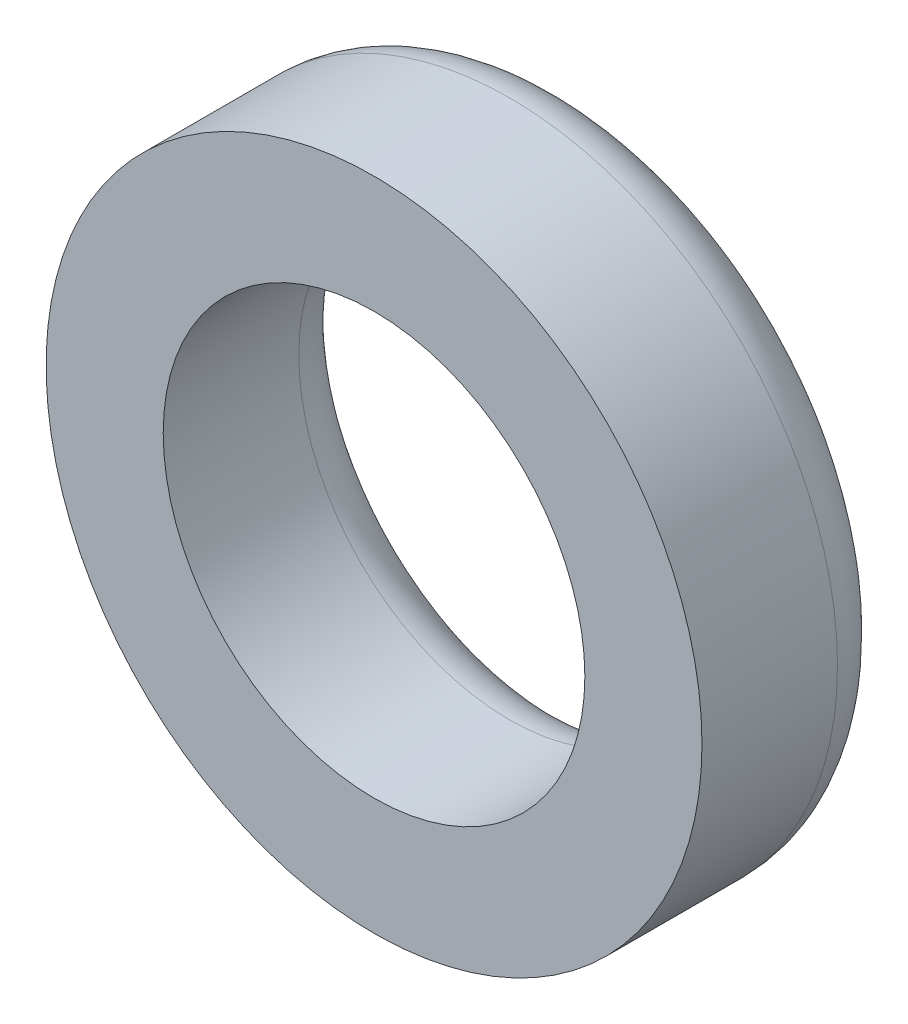
ISO-10303-21;
HEADER;
FILE_DESCRIPTION(('STEP AP214'),'2;1');
FILE_NAME('part.step','',(''),(''),'','','');
FILE_SCHEMA(('AUTOMOTIVE_DESIGN { 1 0 10303 214 1 1 1 1 }'));
ENDSEC;
DATA;
#1=APPLICATION_CONTEXT('core data for automotive mechanical design processes');
#2=APPLICATION_PROTOCOL_DEFINITION('international standard','automotive_design',2000,#1);
#3=PRODUCT_CONTEXT('',#1,'mechanical');
#4=PRODUCT('Part','Part','',(#3));
#5=PRODUCT_RELATED_PRODUCT_CATEGORY('part','',(#4));
#6=PRODUCT_DEFINITION_FORMATION('','',#4);
#7=PRODUCT_DEFINITION_CONTEXT('part definition',#1,'design');
#8=PRODUCT_DEFINITION('design','',#6,#7);
#9=PRODUCT_DEFINITION_SHAPE('','',#8);
#10=(LENGTH_UNIT() NAMED_UNIT(*) SI_UNIT(.MILLI.,.METRE.));
#11=(NAMED_UNIT(*) PLANE_ANGLE_UNIT() SI_UNIT($,.RADIAN.));
#12=(NAMED_UNIT(*) SI_UNIT($,.STERADIAN.) SOLID_ANGLE_UNIT());
#13=UNCERTAINTY_MEASURE_WITH_UNIT(LENGTH_MEASURE(1.E-05),#10,'distance_accuracy_value','');
#14=(GEOMETRIC_REPRESENTATION_CONTEXT(3) GLOBAL_UNCERTAINTY_ASSIGNED_CONTEXT((#13)) GLOBAL_UNIT_ASSIGNED_CONTEXT((#10,
#11,#12)) REPRESENTATION_CONTEXT('',''));
#15=CARTESIAN_POINT('',(0.,0.,0.));
#16=DIRECTION('',(0.,0.,1.));
#17=DIRECTION('',(1.,0.,0.));
#18=AXIS2_PLACEMENT_3D('',#15,#16,#17);
#19=CARTESIAN_POINT('',(0.,0.,-4.05));
#20=DIRECTION('',(0.,0.,1.));
#21=DIRECTION('',(1.,0.,0.));
#22=AXIS2_PLACEMENT_3D('',#19,#20,#21);
#23=TOROIDAL_SURFACE('',#22,8.05,1.75);
#24=CARTESIAN_POINT('',(0.,0.,-4.05));
#25=DIRECTION('',(0.,0.,1.));
#26=DIRECTION('',(1.,0.,0.));
#27=AXIS2_PLACEMENT_3D('',#24,#25,#26);
#28=CIRCLE('',#27,6.3);
#29=CARTESIAN_POINT('',(6.3,0.,-4.05));
#30=VERTEX_POINT('',#29);
#31=EDGE_CURVE('E41',#30,#30,#28,.F.);
#32=ORIENTED_EDGE('',*,*,#31,.F.);
#33=EDGE_LOOP('',(#32));
#34=FACE_BOUND('',#33,.T.);
#35=CARTESIAN_POINT('',(0.,0.,-4.05));
#36=DIRECTION('',(0.,0.,1.));
#37=DIRECTION('',(1.,0.,0.));
#38=AXIS2_PLACEMENT_3D('',#35,#36,#37);
#39=CIRCLE('',#38,9.8);
#40=CARTESIAN_POINT('',(9.8,0.,-4.05));
#41=VERTEX_POINT('',#40);
#42=EDGE_CURVE('E10',#41,#41,#39,.T.);
#43=ORIENTED_EDGE('',*,*,#42,.F.);
#44=EDGE_LOOP('',(#43));
#45=FACE_BOUND('',#44,.T.);
#46=ADVANCED_FACE('F34',(#34,#45),#23,.T.);
#47=CARTESIAN_POINT('',(0.,0.,0.));
#48=DIRECTION('',(0.,0.,1.));
#49=DIRECTION('',(1.,0.,0.));
#50=AXIS2_PLACEMENT_3D('',#47,#48,#49);
#51=CYLINDRICAL_SURFACE('',#50,6.3);
#52=ORIENTED_EDGE('',*,*,#31,.T.);
#53=EDGE_LOOP('',(#52));
#54=FACE_BOUND('',#53,.T.);
#55=CARTESIAN_POINT('',(0.,0.,0.));
#56=DIRECTION('',(0.,0.,1.));
#57=DIRECTION('',(1.,0.,0.));
#58=AXIS2_PLACEMENT_3D('',#55,#56,#57);
#59=CIRCLE('',#58,6.3);
#60=CARTESIAN_POINT('',(6.3,0.,0.));
#61=VERTEX_POINT('',#60);
#62=EDGE_CURVE('E49',#61,#61,#59,.T.);
#63=ORIENTED_EDGE('',*,*,#62,.T.);
#64=EDGE_LOOP('',(#63));
#65=FACE_BOUND('',#64,.T.);
#66=ADVANCED_FACE('F55',(#54,#65),#51,.F.);
#67=CARTESIAN_POINT('',(0.,0.,0.));
#68=DIRECTION('',(0.,0.,1.));
#69=DIRECTION('',(1.,0.,0.));
#70=AXIS2_PLACEMENT_3D('',#67,#68,#69);
#71=CYLINDRICAL_SURFACE('',#70,9.8);
#72=ORIENTED_EDGE('',*,*,#42,.T.);
#73=EDGE_LOOP('',(#72));
#74=FACE_BOUND('',#73,.T.);
#75=CARTESIAN_POINT('',(0.,0.,0.));
#76=DIRECTION('',(0.,0.,1.));
#77=DIRECTION('',(1.,0.,0.));
#78=AXIS2_PLACEMENT_3D('',#75,#76,#77);
#79=CIRCLE('',#78,9.8);
#80=CARTESIAN_POINT('',(9.8,0.,0.));
#81=VERTEX_POINT('',#80);
#82=EDGE_CURVE('E45',#81,#81,#79,.T.);
#83=ORIENTED_EDGE('',*,*,#82,.F.);
#84=EDGE_LOOP('',(#83));
#85=FACE_BOUND('',#84,.T.);
#86=ADVANCED_FACE('F59',(#74,#85),#71,.T.);
#87=CARTESIAN_POINT('',(6.3,0.,0.));
#88=DIRECTION('',(0.,0.,1.));
#89=DIRECTION('',(1.,0.,0.));
#90=AXIS2_PLACEMENT_3D('',#87,#88,#89);
#91=PLANE('',#90);
#92=ORIENTED_EDGE('',*,*,#82,.T.);
#93=EDGE_LOOP('',(#92));
#94=FACE_BOUND('',#93,.T.);
#95=ORIENTED_EDGE('',*,*,#62,.F.);
#96=EDGE_LOOP('',(#95));
#97=FACE_BOUND('',#96,.T.);
#98=ADVANCED_FACE('F57',(#94,#97),#91,.T.);
#99=CLOSED_SHELL('',(#46,#66,#86,#98));
#100=MANIFOLD_SOLID_BREP('B2',#99);
#101=ADVANCED_BREP_SHAPE_REPRESENTATION('',(#18,#100),#14);
#102=SHAPE_DEFINITION_REPRESENTATION(#9,#101);
ENDSEC;
END-ISO-10303-21;
